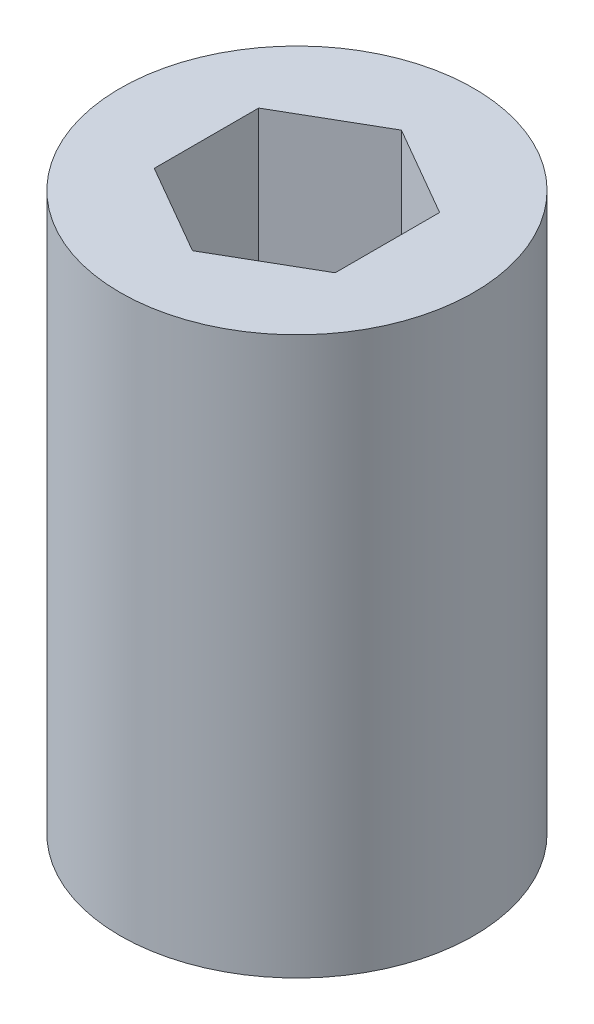
ISO-10303-21;
HEADER;
FILE_DESCRIPTION(('STEP AP214'),'2;1');
FILE_NAME('part.step','',(''),(''),'','','');
FILE_SCHEMA(('AUTOMOTIVE_DESIGN { 1 0 10303 214 1 1 1 1 }'));
ENDSEC;
DATA;
#1=APPLICATION_CONTEXT('core data for automotive mechanical design processes');
#2=APPLICATION_PROTOCOL_DEFINITION('international standard','automotive_design',2000,#1);
#3=PRODUCT_CONTEXT('',#1,'mechanical');
#4=PRODUCT('Part','Part','',(#3));
#5=PRODUCT_RELATED_PRODUCT_CATEGORY('part','',(#4));
#6=PRODUCT_DEFINITION_FORMATION('','',#4);
#7=PRODUCT_DEFINITION_CONTEXT('part definition',#1,'design');
#8=PRODUCT_DEFINITION('design','',#6,#7);
#9=PRODUCT_DEFINITION_SHAPE('','',#8);
#10=(LENGTH_UNIT() NAMED_UNIT(*) SI_UNIT(.MILLI.,.METRE.));
#11=(NAMED_UNIT(*) PLANE_ANGLE_UNIT() SI_UNIT($,.RADIAN.));
#12=(NAMED_UNIT(*) SI_UNIT($,.STERADIAN.) SOLID_ANGLE_UNIT());
#13=UNCERTAINTY_MEASURE_WITH_UNIT(LENGTH_MEASURE(1.E-05),#10,'distance_accuracy_value','');
#14=(GEOMETRIC_REPRESENTATION_CONTEXT(3) GLOBAL_UNCERTAINTY_ASSIGNED_CONTEXT((#13)) GLOBAL_UNIT_ASSIGNED_CONTEXT((#10,
#11,#12)) REPRESENTATION_CONTEXT('',''));
#15=CARTESIAN_POINT('',(0.,0.,0.));
#16=DIRECTION('',(0.,0.,1.));
#17=DIRECTION('',(1.,0.,0.));
#18=AXIS2_PLACEMENT_3D('',#15,#16,#17);
#19=CARTESIAN_POINT('',(6.49519052838329,-80.,-11.25));
#20=DIRECTION('',(0.5,0.,-0.866025403784439));
#21=DIRECTION('',(-0.866025403784439,0.,-0.5));
#22=AXIS2_PLACEMENT_3D('',#19,#20,#21);
#23=PLANE('',#22);
#24=DIRECTION('',(-0.866025403784439,0.,-0.5));
#25=VECTOR('',#24,1.);
#26=CARTESIAN_POINT('',(6.49519052838329,0.,-11.25));
#27=LINE('',#26,#25);
#28=CARTESIAN_POINT('',(12.9903810567666,0.,-7.50000000000001));
#29=VERTEX_POINT('',#28);
#30=CARTESIAN_POINT('',(0.,0.,-15.));
#31=VERTEX_POINT('',#30);
#32=EDGE_CURVE('E138',#29,#31,#27,.T.);
#33=ORIENTED_EDGE('',*,*,#32,.T.);
#34=DIRECTION('',(0.,1.,0.));
#35=VECTOR('',#34,1.);
#36=CARTESIAN_POINT('',(0.,-80.,-15.));
#37=LINE('',#36,#35);
#38=CARTESIAN_POINT('',(0.,-80.,-15.));
#39=VERTEX_POINT('',#38);
#40=EDGE_CURVE('E11',#39,#31,#37,.T.);
#41=ORIENTED_EDGE('',*,*,#40,.F.);
#42=DIRECTION('',(-0.866025403784439,0.,-0.5));
#43=VECTOR('',#42,1.);
#44=CARTESIAN_POINT('',(6.49519052838329,-80.,-11.25));
#45=LINE('',#44,#43);
#46=CARTESIAN_POINT('',(12.9903810567666,-80.,-7.50000000000001));
#47=VERTEX_POINT('',#46);
#48=EDGE_CURVE('E158',#47,#39,#45,.T.);
#49=ORIENTED_EDGE('',*,*,#48,.F.);
#50=DIRECTION('',(0.,1.,0.));
#51=VECTOR('',#50,1.);
#52=CARTESIAN_POINT('',(12.9903810567666,-80.,-7.50000000000001));
#53=LINE('',#52,#51);
#54=EDGE_CURVE('E48',#47,#29,#53,.T.);
#55=ORIENTED_EDGE('',*,*,#54,.T.);
#56=EDGE_LOOP('',(#33,#41,#49,#55));
#57=FACE_BOUND('',#56,.T.);
#58=ADVANCED_FACE('F45',(#57),#23,.F.);
#59=CARTESIAN_POINT('',(-6.49519052838329,-80.,-11.25));
#60=DIRECTION('',(-0.5,0.,-0.866025403784439));
#61=DIRECTION('',(-0.866025403784439,0.,0.5));
#62=AXIS2_PLACEMENT_3D('',#59,#60,#61);
#63=PLANE('',#62);
#64=DIRECTION('',(-0.866025403784439,0.,0.5));
#65=VECTOR('',#64,1.);
#66=CARTESIAN_POINT('',(-6.49519052838329,0.,-11.25));
#67=LINE('',#66,#65);
#68=CARTESIAN_POINT('',(-12.9903810567666,0.,-7.5));
#69=VERTEX_POINT('',#68);
#70=EDGE_CURVE('E83',#31,#69,#67,.T.);
#71=ORIENTED_EDGE('',*,*,#70,.T.);
#72=DIRECTION('',(0.,1.,0.));
#73=VECTOR('',#72,1.);
#74=CARTESIAN_POINT('',(-12.9903810567666,-80.,-7.5));
#75=LINE('',#74,#73);
#76=CARTESIAN_POINT('',(-12.9903810567666,-80.,-7.5));
#77=VERTEX_POINT('',#76);
#78=EDGE_CURVE('E55',#77,#69,#75,.T.);
#79=ORIENTED_EDGE('',*,*,#78,.F.);
#80=DIRECTION('',(-0.866025403784439,0.,0.5));
#81=VECTOR('',#80,1.);
#82=CARTESIAN_POINT('',(-6.49519052838329,-80.,-11.25));
#83=LINE('',#82,#81);
#84=EDGE_CURVE('E63',#39,#77,#83,.T.);
#85=ORIENTED_EDGE('',*,*,#84,.F.);
#86=ORIENTED_EDGE('',*,*,#40,.T.);
#87=EDGE_LOOP('',(#71,#79,#85,#86));
#88=FACE_BOUND('',#87,.T.);
#89=ADVANCED_FACE('F190',(#88),#63,.F.);
#90=CARTESIAN_POINT('',(-12.9903810567666,-80.,0.));
#91=DIRECTION('',(-1.,0.,0.));
#92=DIRECTION('',(0.,0.,1.));
#93=AXIS2_PLACEMENT_3D('',#90,#91,#92);
#94=PLANE('',#93);
#95=DIRECTION('',(0.,0.,1.));
#96=VECTOR('',#95,1.);
#97=CARTESIAN_POINT('',(-12.9903810567666,0.,0.));
#98=LINE('',#97,#96);
#99=CARTESIAN_POINT('',(-12.9903810567666,0.,7.5));
#100=VERTEX_POINT('',#99);
#101=EDGE_CURVE('E116',#69,#100,#98,.T.);
#102=ORIENTED_EDGE('',*,*,#101,.T.);
#103=DIRECTION('',(0.,1.,0.));
#104=VECTOR('',#103,1.);
#105=CARTESIAN_POINT('',(-12.9903810567666,-80.,7.5));
#106=LINE('',#105,#104);
#107=CARTESIAN_POINT('',(-12.9903810567666,-80.,7.5));
#108=VERTEX_POINT('',#107);
#109=EDGE_CURVE('E114',#108,#100,#106,.T.);
#110=ORIENTED_EDGE('',*,*,#109,.F.);
#111=DIRECTION('',(0.,0.,1.));
#112=VECTOR('',#111,1.);
#113=CARTESIAN_POINT('',(-12.9903810567666,-80.,0.));
#114=LINE('',#113,#112);
#115=EDGE_CURVE('E103',#77,#108,#114,.T.);
#116=ORIENTED_EDGE('',*,*,#115,.F.);
#117=ORIENTED_EDGE('',*,*,#78,.T.);
#118=EDGE_LOOP('',(#102,#110,#116,#117));
#119=FACE_BOUND('',#118,.T.);
#120=ADVANCED_FACE('F115',(#119),#94,.F.);
#121=CARTESIAN_POINT('',(-6.49519052838329,-80.,11.25));
#122=DIRECTION('',(-0.5,0.,0.866025403784439));
#123=DIRECTION('',(0.866025403784439,0.,0.5));
#124=AXIS2_PLACEMENT_3D('',#121,#122,#123);
#125=PLANE('',#124);
#126=DIRECTION('',(0.866025403784439,0.,0.5));
#127=VECTOR('',#126,1.);
#128=CARTESIAN_POINT('',(-6.49519052838329,0.,11.25));
#129=LINE('',#128,#127);
#130=CARTESIAN_POINT('',(0.,0.,15.));
#131=VERTEX_POINT('',#130);
#132=EDGE_CURVE('E148',#100,#131,#129,.T.);
#133=ORIENTED_EDGE('',*,*,#132,.T.);
#134=DIRECTION('',(0.,1.,0.));
#135=VECTOR('',#134,1.);
#136=CARTESIAN_POINT('',(0.,-80.,15.));
#137=LINE('',#136,#135);
#138=CARTESIAN_POINT('',(0.,-80.,15.));
#139=VERTEX_POINT('',#138);
#140=EDGE_CURVE('E120',#139,#131,#137,.T.);
#141=ORIENTED_EDGE('',*,*,#140,.F.);
#142=DIRECTION('',(0.866025403784439,0.,0.5));
#143=VECTOR('',#142,1.);
#144=CARTESIAN_POINT('',(-6.49519052838329,-80.,11.25));
#145=LINE('',#144,#143);
#146=EDGE_CURVE('E108',#108,#139,#145,.T.);
#147=ORIENTED_EDGE('',*,*,#146,.F.);
#148=ORIENTED_EDGE('',*,*,#109,.T.);
#149=EDGE_LOOP('',(#133,#141,#147,#148));
#150=FACE_BOUND('',#149,.T.);
#151=ADVANCED_FACE('F122',(#150),#125,.F.);
#152=CARTESIAN_POINT('',(6.49519052838329,-80.,11.25));
#153=DIRECTION('',(0.5,0.,0.866025403784439));
#154=DIRECTION('',(0.866025403784439,0.,-0.5));
#155=AXIS2_PLACEMENT_3D('',#152,#153,#154);
#156=PLANE('',#155);
#157=DIRECTION('',(0.866025403784439,0.,-0.5));
#158=VECTOR('',#157,1.);
#159=CARTESIAN_POINT('',(6.49519052838329,0.,11.25));
#160=LINE('',#159,#158);
#161=CARTESIAN_POINT('',(12.9903810567666,0.,7.50000000000001));
#162=VERTEX_POINT('',#161);
#163=EDGE_CURVE('E145',#131,#162,#160,.T.);
#164=ORIENTED_EDGE('',*,*,#163,.T.);
#165=DIRECTION('',(0.,1.,0.));
#166=VECTOR('',#165,1.);
#167=CARTESIAN_POINT('',(12.9903810567666,-80.,7.50000000000001));
#168=LINE('',#167,#166);
#169=CARTESIAN_POINT('',(12.9903810567666,-80.,7.50000000000001));
#170=VERTEX_POINT('',#169);
#171=EDGE_CURVE('E163',#170,#162,#168,.T.);
#172=ORIENTED_EDGE('',*,*,#171,.F.);
#173=DIRECTION('',(0.866025403784439,0.,-0.5));
#174=VECTOR('',#173,1.);
#175=CARTESIAN_POINT('',(6.49519052838329,-80.,11.25));
#176=LINE('',#175,#174);
#177=EDGE_CURVE('E126',#139,#170,#176,.T.);
#178=ORIENTED_EDGE('',*,*,#177,.F.);
#179=ORIENTED_EDGE('',*,*,#140,.T.);
#180=EDGE_LOOP('',(#164,#172,#178,#179));
#181=FACE_BOUND('',#180,.T.);
#182=ADVANCED_FACE('F180',(#181),#156,.F.);
#183=CARTESIAN_POINT('',(12.9903810567666,-80.,0.));
#184=DIRECTION('',(1.,0.,0.));
#185=DIRECTION('',(0.,0.,-1.));
#186=AXIS2_PLACEMENT_3D('',#183,#184,#185);
#187=PLANE('',#186);
#188=DIRECTION('',(0.,0.,-1.));
#189=VECTOR('',#188,1.);
#190=CARTESIAN_POINT('',(12.9903810567666,0.,0.));
#191=LINE('',#190,#189);
#192=EDGE_CURVE('E142',#162,#29,#191,.T.);
#193=ORIENTED_EDGE('',*,*,#192,.T.);
#194=ORIENTED_EDGE('',*,*,#54,.F.);
#195=DIRECTION('',(0.,0.,-1.));
#196=VECTOR('',#195,1.);
#197=CARTESIAN_POINT('',(12.9903810567666,-80.,0.));
#198=LINE('',#197,#196);
#199=EDGE_CURVE('E95',#170,#47,#198,.T.);
#200=ORIENTED_EDGE('',*,*,#199,.F.);
#201=ORIENTED_EDGE('',*,*,#171,.T.);
#202=EDGE_LOOP('',(#193,#194,#200,#201));
#203=FACE_BOUND('',#202,.T.);
#204=ADVANCED_FACE('F177',(#203),#187,.F.);
#205=CARTESIAN_POINT('',(0.,-80.,0.));
#206=DIRECTION('',(0.,1.,0.));
#207=DIRECTION('',(0.,0.,1.));
#208=AXIS2_PLACEMENT_3D('',#205,#206,#207);
#209=CYLINDRICAL_SURFACE('',#208,25.4);
#210=CARTESIAN_POINT('',(0.,-80.,0.));
#211=DIRECTION('',(0.,1.,0.));
#212=DIRECTION('',(0.,0.,1.));
#213=AXIS2_PLACEMENT_3D('',#210,#211,#212);
#214=CIRCLE('',#213,25.4);
#215=CARTESIAN_POINT('',(0.,-80.,25.4));
#216=VERTEX_POINT('',#215);
#217=EDGE_CURVE('E134',#216,#216,#214,.T.);
#218=ORIENTED_EDGE('',*,*,#217,.T.);
#219=EDGE_LOOP('',(#218));
#220=FACE_BOUND('',#219,.T.);
#221=CARTESIAN_POINT('',(0.,0.,0.));
#222=DIRECTION('',(0.,1.,0.));
#223=DIRECTION('',(0.,0.,1.));
#224=AXIS2_PLACEMENT_3D('',#221,#222,#223);
#225=CIRCLE('',#224,25.4);
#226=CARTESIAN_POINT('',(0.,0.,25.4));
#227=VERTEX_POINT('',#226);
#228=EDGE_CURVE('E155',#227,#227,#225,.T.);
#229=ORIENTED_EDGE('',*,*,#228,.F.);
#230=EDGE_LOOP('',(#229));
#231=FACE_BOUND('',#230,.T.);
#232=ADVANCED_FACE('F179',(#220,#231),#209,.T.);
#233=CARTESIAN_POINT('',(0.,-80.,0.));
#234=DIRECTION('',(0.,1.,0.));
#235=DIRECTION('',(0.,0.,1.));
#236=AXIS2_PLACEMENT_3D('',#233,#234,#235);
#237=PLANE('',#236);
#238=ORIENTED_EDGE('',*,*,#48,.T.);
#239=ORIENTED_EDGE('',*,*,#84,.T.);
#240=ORIENTED_EDGE('',*,*,#115,.T.);
#241=ORIENTED_EDGE('',*,*,#146,.T.);
#242=ORIENTED_EDGE('',*,*,#177,.T.);
#243=ORIENTED_EDGE('',*,*,#199,.T.);
#244=EDGE_LOOP('',(#238,#239,#240,#241,#242,#243));
#245=FACE_BOUND('',#244,.T.);
#246=ORIENTED_EDGE('',*,*,#217,.F.);
#247=EDGE_LOOP('',(#246));
#248=FACE_BOUND('',#247,.T.);
#249=ADVANCED_FACE('F105',(#245,#248),#237,.F.);
#250=CARTESIAN_POINT('',(0.,0.,0.));
#251=DIRECTION('',(0.,1.,0.));
#252=DIRECTION('',(0.,0.,1.));
#253=AXIS2_PLACEMENT_3D('',#250,#251,#252);
#254=PLANE('',#253);
#255=ORIENTED_EDGE('',*,*,#32,.F.);
#256=ORIENTED_EDGE('',*,*,#192,.F.);
#257=ORIENTED_EDGE('',*,*,#163,.F.);
#258=ORIENTED_EDGE('',*,*,#132,.F.);
#259=ORIENTED_EDGE('',*,*,#101,.F.);
#260=ORIENTED_EDGE('',*,*,#70,.F.);
#261=EDGE_LOOP('',(#255,#256,#257,#258,#259,#260));
#262=FACE_BOUND('',#261,.T.);
#263=ORIENTED_EDGE('',*,*,#228,.T.);
#264=EDGE_LOOP('',(#263));
#265=FACE_BOUND('',#264,.T.);
#266=ADVANCED_FACE('F174',(#262,#265),#254,.T.);
#267=CLOSED_SHELL('',(#58,#89,#120,#151,#182,#204,#232,#249,#266));
#268=MANIFOLD_SOLID_BREP('B2',#267);
#269=ADVANCED_BREP_SHAPE_REPRESENTATION('',(#18,#268),#14);
#270=SHAPE_DEFINITION_REPRESENTATION(#9,#269);
ENDSEC;
END-ISO-10303-21;
